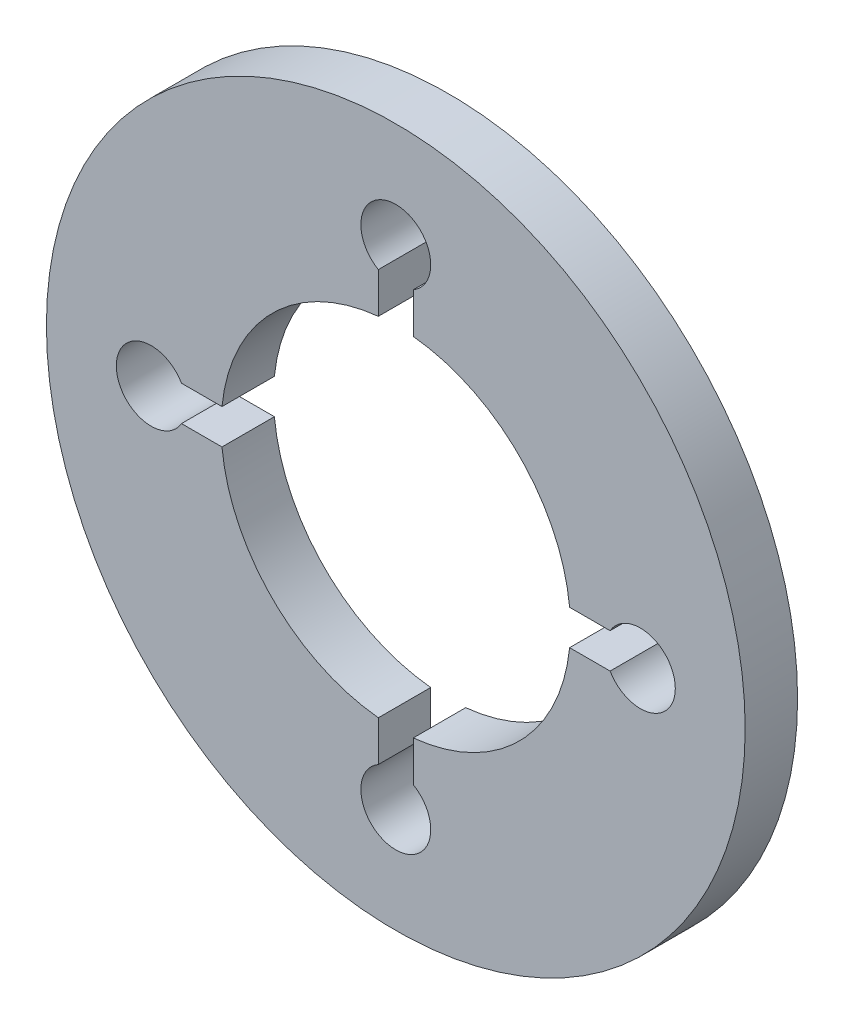
ISO-10303-21;
HEADER;
FILE_DESCRIPTION(('STEP AP214'),'2;1');
FILE_NAME('part.step','',(''),(''),'','','');
FILE_SCHEMA(('AUTOMOTIVE_DESIGN { 1 0 10303 214 1 1 1 1 }'));
ENDSEC;
DATA;
#1=APPLICATION_CONTEXT('core data for automotive mechanical design processes');
#2=APPLICATION_PROTOCOL_DEFINITION('international standard','automotive_design',2000,#1);
#3=PRODUCT_CONTEXT('',#1,'mechanical');
#4=PRODUCT('Part','Part','',(#3));
#5=PRODUCT_RELATED_PRODUCT_CATEGORY('part','',(#4));
#6=PRODUCT_DEFINITION_FORMATION('','',#4);
#7=PRODUCT_DEFINITION_CONTEXT('part definition',#1,'design');
#8=PRODUCT_DEFINITION('design','',#6,#7);
#9=PRODUCT_DEFINITION_SHAPE('','',#8);
#10=(LENGTH_UNIT() NAMED_UNIT(*) SI_UNIT(.MILLI.,.METRE.));
#11=(NAMED_UNIT(*) PLANE_ANGLE_UNIT() SI_UNIT($,.RADIAN.));
#12=(NAMED_UNIT(*) SI_UNIT($,.STERADIAN.) SOLID_ANGLE_UNIT());
#13=UNCERTAINTY_MEASURE_WITH_UNIT(LENGTH_MEASURE(1.E-05),#10,'distance_accuracy_value','');
#14=(GEOMETRIC_REPRESENTATION_CONTEXT(3) GLOBAL_UNCERTAINTY_ASSIGNED_CONTEXT((#13)) GLOBAL_UNIT_ASSIGNED_CONTEXT((#10,
#11,#12)) REPRESENTATION_CONTEXT('',''));
#15=CARTESIAN_POINT('',(0.,0.,0.));
#16=DIRECTION('',(0.,0.,1.));
#17=DIRECTION('',(1.,0.,0.));
#18=AXIS2_PLACEMENT_3D('',#15,#16,#17);
#19=CARTESIAN_POINT('',(0.,0.,0.75));
#20=DIRECTION('',(0.,0.,1.));
#21=DIRECTION('',(1.,0.,0.));
#22=AXIS2_PLACEMENT_3D('',#19,#20,#21);
#23=PLANE('',#22);
#24=CARTESIAN_POINT('',(0.,0.,0.75));
#25=DIRECTION('',(0.,0.,1.));
#26=DIRECTION('',(1.,0.,0.));
#27=AXIS2_PLACEMENT_3D('',#24,#25,#26);
#28=CIRCLE('',#27,5.);
#29=CARTESIAN_POINT('',(5.,0.,0.75));
#30=VERTEX_POINT('',#29);
#31=EDGE_CURVE('E11',#30,#30,#28,.T.);
#32=ORIENTED_EDGE('',*,*,#31,.T.);
#33=EDGE_LOOP('',(#32));
#34=FACE_BOUND('',#33,.T.);
#35=DIRECTION('',(1.,0.,0.));
#36=VECTOR('',#35,1.);
#37=CARTESIAN_POINT('',(3.06698729810778,-0.25,0.75));
#38=LINE('',#37,#36);
#39=CARTESIAN_POINT('',(2.48746859276655,-0.250000000000009,0.75));
#40=VERTEX_POINT('',#39);
#41=CARTESIAN_POINT('',(3.06698729810778,-0.25,0.75));
#42=VERTEX_POINT('',#41);
#43=EDGE_CURVE('E153',#40,#42,#38,.T.);
#44=ORIENTED_EDGE('',*,*,#43,.F.);
#45=CARTESIAN_POINT('',(0.,0.,0.75));
#46=DIRECTION('',(0.,0.,1.));
#47=DIRECTION('',(1.,0.,0.));
#48=AXIS2_PLACEMENT_3D('',#45,#46,#47);
#49=CIRCLE('',#48,2.5);
#50=CARTESIAN_POINT('',(0.249999999999983,-2.48746859276655,0.75));
#51=VERTEX_POINT('',#50);
#52=EDGE_CURVE('E145',#51,#40,#49,.T.);
#53=ORIENTED_EDGE('',*,*,#52,.F.);
#54=DIRECTION('',(0.,1.,0.));
#55=VECTOR('',#54,1.);
#56=CARTESIAN_POINT('',(0.25,-3.06698729810778,0.75));
#57=LINE('',#56,#55);
#58=CARTESIAN_POINT('',(0.25,-3.06698729810778,0.75));
#59=VERTEX_POINT('',#58);
#60=EDGE_CURVE('E193',#59,#51,#57,.T.);
#61=ORIENTED_EDGE('',*,*,#60,.F.);
#62=CARTESIAN_POINT('',(0.,-3.5,0.75));
#63=DIRECTION('',(0.,0.,1.));
#64=DIRECTION('',(1.,0.,0.));
#65=AXIS2_PLACEMENT_3D('',#62,#63,#64);
#66=CIRCLE('',#65,0.5);
#67=CARTESIAN_POINT('',(-0.25,-3.06698729810778,0.75));
#68=VERTEX_POINT('',#67);
#69=EDGE_CURVE('E191',#68,#59,#66,.T.);
#70=ORIENTED_EDGE('',*,*,#69,.F.);
#71=DIRECTION('',(0.,-1.,0.));
#72=VECTOR('',#71,1.);
#73=CARTESIAN_POINT('',(-0.25,-3.06698729810778,0.75));
#74=LINE('',#73,#72);
#75=CARTESIAN_POINT('',(-0.250000000000018,-2.48746859276655,0.75));
#76=VERTEX_POINT('',#75);
#77=EDGE_CURVE('E189',#76,#68,#74,.T.);
#78=ORIENTED_EDGE('',*,*,#77,.F.);
#79=CARTESIAN_POINT('',(0.,0.,0.75));
#80=DIRECTION('',(0.,0.,1.));
#81=DIRECTION('',(1.,0.,0.));
#82=AXIS2_PLACEMENT_3D('',#79,#80,#81);
#83=CIRCLE('',#82,2.5);
#84=CARTESIAN_POINT('',(-2.48746859276655,-0.249999999999973,0.75));
#85=VERTEX_POINT('',#84);
#86=EDGE_CURVE('E187',#85,#76,#83,.T.);
#87=ORIENTED_EDGE('',*,*,#86,.F.);
#88=DIRECTION('',(1.,0.,0.));
#89=VECTOR('',#88,1.);
#90=CARTESIAN_POINT('',(-3.06698729810778,-0.249999999999999,0.75));
#91=LINE('',#90,#89);
#92=CARTESIAN_POINT('',(-3.06698729810778,-0.249999999999999,0.75));
#93=VERTEX_POINT('',#92);
#94=EDGE_CURVE('E185',#93,#85,#91,.T.);
#95=ORIENTED_EDGE('',*,*,#94,.F.);
#96=CARTESIAN_POINT('',(-3.5,0.,0.75));
#97=DIRECTION('',(0.,0.,1.));
#98=DIRECTION('',(1.,0.,0.));
#99=AXIS2_PLACEMENT_3D('',#96,#97,#98);
#100=CIRCLE('',#99,0.5);
#101=CARTESIAN_POINT('',(-3.06698729810778,0.250000000000001,0.75));
#102=VERTEX_POINT('',#101);
#103=EDGE_CURVE('E183',#102,#93,#100,.T.);
#104=ORIENTED_EDGE('',*,*,#103,.F.);
#105=DIRECTION('',(-1.,0.,0.));
#106=VECTOR('',#105,1.);
#107=CARTESIAN_POINT('',(-3.06698729810778,0.250000000000001,0.75));
#108=LINE('',#107,#106);
#109=CARTESIAN_POINT('',(-2.48746859276655,0.250000000000027,0.75));
#110=VERTEX_POINT('',#109);
#111=EDGE_CURVE('E181',#110,#102,#108,.T.);
#112=ORIENTED_EDGE('',*,*,#111,.F.);
#113=CARTESIAN_POINT('',(0.,0.,0.75));
#114=DIRECTION('',(0.,0.,1.));
#115=DIRECTION('',(1.,0.,0.));
#116=AXIS2_PLACEMENT_3D('',#113,#114,#115);
#117=CIRCLE('',#116,2.5);
#118=CARTESIAN_POINT('',(-0.25,2.48746859276655,0.75));
#119=VERTEX_POINT('',#118);
#120=EDGE_CURVE('E179',#119,#110,#117,.T.);
#121=ORIENTED_EDGE('',*,*,#120,.F.);
#122=DIRECTION('',(0.,-1.,0.));
#123=VECTOR('',#122,1.);
#124=CARTESIAN_POINT('',(-0.25,3.06698729810778,0.75));
#125=LINE('',#124,#123);
#126=CARTESIAN_POINT('',(-0.25,3.06698729810778,0.75));
#127=VERTEX_POINT('',#126);
#128=EDGE_CURVE('E177',#127,#119,#125,.T.);
#129=ORIENTED_EDGE('',*,*,#128,.F.);
#130=CARTESIAN_POINT('',(0.,3.5,0.75));
#131=DIRECTION('',(0.,0.,1.));
#132=DIRECTION('',(1.,0.,0.));
#133=AXIS2_PLACEMENT_3D('',#130,#131,#132);
#134=CIRCLE('',#133,0.5);
#135=CARTESIAN_POINT('',(0.25,3.06698729810778,0.75));
#136=VERTEX_POINT('',#135);
#137=EDGE_CURVE('E175',#136,#127,#134,.T.);
#138=ORIENTED_EDGE('',*,*,#137,.F.);
#139=DIRECTION('',(0.,1.,0.));
#140=VECTOR('',#139,1.);
#141=CARTESIAN_POINT('',(0.25,3.06698729810778,0.75));
#142=LINE('',#141,#140);
#143=CARTESIAN_POINT('',(0.25,2.48746859276655,0.75));
#144=VERTEX_POINT('',#143);
#145=EDGE_CURVE('E173',#144,#136,#142,.T.);
#146=ORIENTED_EDGE('',*,*,#145,.F.);
#147=CARTESIAN_POINT('',(0.,0.,0.75));
#148=DIRECTION('',(0.,0.,1.));
#149=DIRECTION('',(1.,0.,0.));
#150=AXIS2_PLACEMENT_3D('',#147,#148,#149);
#151=CIRCLE('',#150,2.5);
#152=CARTESIAN_POINT('',(2.48746859276655,0.249999999999991,0.75));
#153=VERTEX_POINT('',#152);
#154=EDGE_CURVE('E171',#153,#144,#151,.T.);
#155=ORIENTED_EDGE('',*,*,#154,.F.);
#156=DIRECTION('',(-1.,0.,0.));
#157=VECTOR('',#156,1.);
#158=CARTESIAN_POINT('',(3.06698729810778,0.25,0.75));
#159=LINE('',#158,#157);
#160=CARTESIAN_POINT('',(3.06698729810778,0.25,0.75));
#161=VERTEX_POINT('',#160);
#162=EDGE_CURVE('E167',#161,#153,#159,.T.);
#163=ORIENTED_EDGE('',*,*,#162,.F.);
#164=CARTESIAN_POINT('',(3.5,0.,0.75));
#165=DIRECTION('',(0.,0.,1.));
#166=DIRECTION('',(1.,0.,0.));
#167=AXIS2_PLACEMENT_3D('',#164,#165,#166);
#168=CIRCLE('',#167,0.5);
#169=EDGE_CURVE('E165',#42,#161,#168,.T.);
#170=ORIENTED_EDGE('',*,*,#169,.F.);
#171=EDGE_LOOP('',(#44,#53,#61,#70,#78,#87,#95,#104,#112,#121,#129,#138,#146,#155,#163,#170));
#172=FACE_BOUND('',#171,.T.);
#173=ADVANCED_FACE('F32',(#34,#172),#23,.T.);
#174=CARTESIAN_POINT('',(0.,0.,0.));
#175=DIRECTION('',(0.,0.,1.));
#176=DIRECTION('',(1.,0.,0.));
#177=AXIS2_PLACEMENT_3D('',#174,#175,#176);
#178=PLANE('',#177);
#179=CARTESIAN_POINT('',(0.,0.,0.));
#180=DIRECTION('',(0.,0.,1.));
#181=DIRECTION('',(1.,0.,0.));
#182=AXIS2_PLACEMENT_3D('',#179,#180,#181);
#183=CIRCLE('',#182,5.);
#184=CARTESIAN_POINT('',(5.,0.,0.));
#185=VERTEX_POINT('',#184);
#186=EDGE_CURVE('E36',#185,#185,#183,.T.);
#187=ORIENTED_EDGE('',*,*,#186,.F.);
#188=EDGE_LOOP('',(#187));
#189=FACE_BOUND('',#188,.T.);
#190=CARTESIAN_POINT('',(0.,0.,0.));
#191=DIRECTION('',(0.,0.,1.));
#192=DIRECTION('',(1.,0.,0.));
#193=AXIS2_PLACEMENT_3D('',#190,#191,#192);
#194=CIRCLE('',#193,2.5);
#195=CARTESIAN_POINT('',(0.249999999999983,-2.48746859276655,0.));
#196=VERTEX_POINT('',#195);
#197=CARTESIAN_POINT('',(2.48746859276655,-0.250000000000009,0.));
#198=VERTEX_POINT('',#197);
#199=EDGE_CURVE('E55',#196,#198,#194,.T.);
#200=ORIENTED_EDGE('',*,*,#199,.T.);
#201=DIRECTION('',(1.,0.,0.));
#202=VECTOR('',#201,1.);
#203=CARTESIAN_POINT('',(3.06698729810778,-0.25,0.));
#204=LINE('',#203,#202);
#205=CARTESIAN_POINT('',(3.06698729810778,-0.25,0.));
#206=VERTEX_POINT('',#205);
#207=EDGE_CURVE('E160',#198,#206,#204,.T.);
#208=ORIENTED_EDGE('',*,*,#207,.T.);
#209=CARTESIAN_POINT('',(3.5,0.,0.));
#210=DIRECTION('',(0.,0.,1.));
#211=DIRECTION('',(1.,0.,0.));
#212=AXIS2_PLACEMENT_3D('',#209,#210,#211);
#213=CIRCLE('',#212,0.5);
#214=CARTESIAN_POINT('',(3.06698729810778,0.25,0.));
#215=VERTEX_POINT('',#214);
#216=EDGE_CURVE('E197',#206,#215,#213,.T.);
#217=ORIENTED_EDGE('',*,*,#216,.T.);
#218=DIRECTION('',(-1.,0.,0.));
#219=VECTOR('',#218,1.);
#220=CARTESIAN_POINT('',(3.06698729810778,0.25,0.));
#221=LINE('',#220,#219);
#222=CARTESIAN_POINT('',(2.48746859276655,0.249999999999991,0.));
#223=VERTEX_POINT('',#222);
#224=EDGE_CURVE('E200',#215,#223,#221,.T.);
#225=ORIENTED_EDGE('',*,*,#224,.T.);
#226=CARTESIAN_POINT('',(0.,0.,0.));
#227=DIRECTION('',(0.,0.,1.));
#228=DIRECTION('',(1.,0.,0.));
#229=AXIS2_PLACEMENT_3D('',#226,#227,#228);
#230=CIRCLE('',#229,2.5);
#231=CARTESIAN_POINT('',(0.25,2.48746859276655,0.));
#232=VERTEX_POINT('',#231);
#233=EDGE_CURVE('E203',#223,#232,#230,.T.);
#234=ORIENTED_EDGE('',*,*,#233,.T.);
#235=DIRECTION('',(0.,1.,0.));
#236=VECTOR('',#235,1.);
#237=CARTESIAN_POINT('',(0.25,3.06698729810778,0.));
#238=LINE('',#237,#236);
#239=CARTESIAN_POINT('',(0.25,3.06698729810778,0.));
#240=VERTEX_POINT('',#239);
#241=EDGE_CURVE('E206',#232,#240,#238,.T.);
#242=ORIENTED_EDGE('',*,*,#241,.T.);
#243=CARTESIAN_POINT('',(0.,3.5,0.));
#244=DIRECTION('',(0.,0.,1.));
#245=DIRECTION('',(1.,0.,0.));
#246=AXIS2_PLACEMENT_3D('',#243,#244,#245);
#247=CIRCLE('',#246,0.5);
#248=CARTESIAN_POINT('',(-0.25,3.06698729810778,0.));
#249=VERTEX_POINT('',#248);
#250=EDGE_CURVE('E209',#240,#249,#247,.T.);
#251=ORIENTED_EDGE('',*,*,#250,.T.);
#252=DIRECTION('',(0.,-1.,0.));
#253=VECTOR('',#252,1.);
#254=CARTESIAN_POINT('',(-0.25,3.06698729810778,0.));
#255=LINE('',#254,#253);
#256=CARTESIAN_POINT('',(-0.25,2.48746859276655,0.));
#257=VERTEX_POINT('',#256);
#258=EDGE_CURVE('E212',#249,#257,#255,.T.);
#259=ORIENTED_EDGE('',*,*,#258,.T.);
#260=CARTESIAN_POINT('',(0.,0.,0.));
#261=DIRECTION('',(0.,0.,1.));
#262=DIRECTION('',(1.,0.,0.));
#263=AXIS2_PLACEMENT_3D('',#260,#261,#262);
#264=CIRCLE('',#263,2.5);
#265=CARTESIAN_POINT('',(-2.48746859276655,0.250000000000027,0.));
#266=VERTEX_POINT('',#265);
#267=EDGE_CURVE('E215',#257,#266,#264,.T.);
#268=ORIENTED_EDGE('',*,*,#267,.T.);
#269=DIRECTION('',(-1.,0.,0.));
#270=VECTOR('',#269,1.);
#271=CARTESIAN_POINT('',(-3.06698729810778,0.250000000000001,0.));
#272=LINE('',#271,#270);
#273=CARTESIAN_POINT('',(-3.06698729810778,0.250000000000001,0.));
#274=VERTEX_POINT('',#273);
#275=EDGE_CURVE('E218',#266,#274,#272,.T.);
#276=ORIENTED_EDGE('',*,*,#275,.T.);
#277=CARTESIAN_POINT('',(-3.5,0.,0.));
#278=DIRECTION('',(0.,0.,1.));
#279=DIRECTION('',(1.,0.,0.));
#280=AXIS2_PLACEMENT_3D('',#277,#278,#279);
#281=CIRCLE('',#280,0.5);
#282=CARTESIAN_POINT('',(-3.06698729810778,-0.249999999999999,0.));
#283=VERTEX_POINT('',#282);
#284=EDGE_CURVE('E221',#274,#283,#281,.T.);
#285=ORIENTED_EDGE('',*,*,#284,.T.);
#286=DIRECTION('',(1.,0.,0.));
#287=VECTOR('',#286,1.);
#288=CARTESIAN_POINT('',(-3.06698729810778,-0.249999999999999,0.));
#289=LINE('',#288,#287);
#290=CARTESIAN_POINT('',(-2.48746859276655,-0.249999999999973,0.));
#291=VERTEX_POINT('',#290);
#292=EDGE_CURVE('E224',#283,#291,#289,.T.);
#293=ORIENTED_EDGE('',*,*,#292,.T.);
#294=CARTESIAN_POINT('',(0.,0.,0.));
#295=DIRECTION('',(0.,0.,1.));
#296=DIRECTION('',(1.,0.,0.));
#297=AXIS2_PLACEMENT_3D('',#294,#295,#296);
#298=CIRCLE('',#297,2.5);
#299=CARTESIAN_POINT('',(-0.250000000000018,-2.48746859276655,0.));
#300=VERTEX_POINT('',#299);
#301=EDGE_CURVE('E227',#291,#300,#298,.T.);
#302=ORIENTED_EDGE('',*,*,#301,.T.);
#303=DIRECTION('',(0.,-1.,0.));
#304=VECTOR('',#303,1.);
#305=CARTESIAN_POINT('',(-0.25,-3.06698729810778,0.));
#306=LINE('',#305,#304);
#307=CARTESIAN_POINT('',(-0.25,-3.06698729810778,0.));
#308=VERTEX_POINT('',#307);
#309=EDGE_CURVE('E230',#300,#308,#306,.T.);
#310=ORIENTED_EDGE('',*,*,#309,.T.);
#311=CARTESIAN_POINT('',(0.,-3.5,0.));
#312=DIRECTION('',(0.,0.,1.));
#313=DIRECTION('',(1.,0.,0.));
#314=AXIS2_PLACEMENT_3D('',#311,#312,#313);
#315=CIRCLE('',#314,0.5);
#316=CARTESIAN_POINT('',(0.25,-3.06698729810778,0.));
#317=VERTEX_POINT('',#316);
#318=EDGE_CURVE('E233',#308,#317,#315,.T.);
#319=ORIENTED_EDGE('',*,*,#318,.T.);
#320=DIRECTION('',(0.,1.,0.));
#321=VECTOR('',#320,1.);
#322=CARTESIAN_POINT('',(0.25,-3.06698729810778,0.));
#323=LINE('',#322,#321);
#324=EDGE_CURVE('E154',#317,#196,#323,.T.);
#325=ORIENTED_EDGE('',*,*,#324,.T.);
#326=EDGE_LOOP('',(#200,#208,#217,#225,#234,#242,#251,#259,#268,#276,#285,#293,#302,#310,#319,#325));
#327=FACE_BOUND('',#326,.T.);
#328=ADVANCED_FACE('F270',(#189,#327),#178,.F.);
#329=CARTESIAN_POINT('',(0.,0.,0.75));
#330=DIRECTION('',(0.,0.,-1.));
#331=DIRECTION('',(-1.,0.,0.));
#332=AXIS2_PLACEMENT_3D('',#329,#330,#331);
#333=CYLINDRICAL_SURFACE('',#332,5.);
#334=ORIENTED_EDGE('',*,*,#31,.F.);
#335=EDGE_LOOP('',(#334));
#336=FACE_BOUND('',#335,.T.);
#337=ORIENTED_EDGE('',*,*,#186,.T.);
#338=EDGE_LOOP('',(#337));
#339=FACE_BOUND('',#338,.T.);
#340=ADVANCED_FACE('F34',(#336,#339),#333,.T.);
#341=CARTESIAN_POINT('',(0.,0.,0.75));
#342=DIRECTION('',(0.,0.,-1.));
#343=DIRECTION('',(-1.,0.,0.));
#344=AXIS2_PLACEMENT_3D('',#341,#342,#343);
#345=CYLINDRICAL_SURFACE('',#344,2.5);
#346=ORIENTED_EDGE('',*,*,#199,.F.);
#347=DIRECTION('',(0.,0.,-1.));
#348=VECTOR('',#347,1.);
#349=CARTESIAN_POINT('',(0.249999999999983,-2.48746859276655,0.75));
#350=LINE('',#349,#348);
#351=EDGE_CURVE('E149',#51,#196,#350,.T.);
#352=ORIENTED_EDGE('',*,*,#351,.F.);
#353=ORIENTED_EDGE('',*,*,#52,.T.);
#354=DIRECTION('',(0.,0.,-1.));
#355=VECTOR('',#354,1.);
#356=CARTESIAN_POINT('',(2.48746859276655,-0.250000000000009,0.75));
#357=LINE('',#356,#355);
#358=EDGE_CURVE('E148',#40,#198,#357,.T.);
#359=ORIENTED_EDGE('',*,*,#358,.T.);
#360=EDGE_LOOP('',(#346,#352,#353,#359));
#361=FACE_BOUND('',#360,.T.);
#362=ADVANCED_FACE('F147',(#361),#345,.F.);
#363=CARTESIAN_POINT('',(3.06698729810778,-0.25,0.75));
#364=DIRECTION('',(0.,1.,0.));
#365=DIRECTION('',(-1.,0.,0.));
#366=AXIS2_PLACEMENT_3D('',#363,#364,#365);
#367=PLANE('',#366);
#368=ORIENTED_EDGE('',*,*,#207,.F.);
#369=ORIENTED_EDGE('',*,*,#358,.F.);
#370=ORIENTED_EDGE('',*,*,#43,.T.);
#371=DIRECTION('',(0.,0.,-1.));
#372=VECTOR('',#371,1.);
#373=CARTESIAN_POINT('',(3.06698729810778,-0.25,0.75));
#374=LINE('',#373,#372);
#375=EDGE_CURVE('E161',#42,#206,#374,.T.);
#376=ORIENTED_EDGE('',*,*,#375,.T.);
#377=EDGE_LOOP('',(#368,#369,#370,#376));
#378=FACE_BOUND('',#377,.T.);
#379=ADVANCED_FACE('F157',(#378),#367,.T.);
#380=CARTESIAN_POINT('',(3.5,0.,0.75));
#381=DIRECTION('',(0.,0.,-1.));
#382=DIRECTION('',(-1.,0.,0.));
#383=AXIS2_PLACEMENT_3D('',#380,#381,#382);
#384=CYLINDRICAL_SURFACE('',#383,0.5);
#385=ORIENTED_EDGE('',*,*,#216,.F.);
#386=ORIENTED_EDGE('',*,*,#375,.F.);
#387=ORIENTED_EDGE('',*,*,#169,.T.);
#388=DIRECTION('',(0.,0.,-1.));
#389=VECTOR('',#388,1.);
#390=CARTESIAN_POINT('',(3.06698729810778,0.25,0.75));
#391=LINE('',#390,#389);
#392=EDGE_CURVE('E262',#161,#215,#391,.T.);
#393=ORIENTED_EDGE('',*,*,#392,.T.);
#394=EDGE_LOOP('',(#385,#386,#387,#393));
#395=FACE_BOUND('',#394,.T.);
#396=ADVANCED_FACE('F266',(#395),#384,.F.);
#397=CARTESIAN_POINT('',(3.06698729810778,0.25,0.75));
#398=DIRECTION('',(0.,-1.,0.));
#399=DIRECTION('',(1.,0.,0.));
#400=AXIS2_PLACEMENT_3D('',#397,#398,#399);
#401=PLANE('',#400);
#402=ORIENTED_EDGE('',*,*,#224,.F.);
#403=ORIENTED_EDGE('',*,*,#392,.F.);
#404=ORIENTED_EDGE('',*,*,#162,.T.);
#405=DIRECTION('',(0.,0.,-1.));
#406=VECTOR('',#405,1.);
#407=CARTESIAN_POINT('',(2.48746859276655,0.249999999999991,0.75));
#408=LINE('',#407,#406);
#409=EDGE_CURVE('E260',#153,#223,#408,.T.);
#410=ORIENTED_EDGE('',*,*,#409,.T.);
#411=EDGE_LOOP('',(#402,#403,#404,#410));
#412=FACE_BOUND('',#411,.T.);
#413=ADVANCED_FACE('F328',(#412),#401,.T.);
#414=CARTESIAN_POINT('',(0.,0.,0.75));
#415=DIRECTION('',(0.,0.,-1.));
#416=DIRECTION('',(-1.,0.,0.));
#417=AXIS2_PLACEMENT_3D('',#414,#415,#416);
#418=CYLINDRICAL_SURFACE('',#417,2.5);
#419=ORIENTED_EDGE('',*,*,#233,.F.);
#420=ORIENTED_EDGE('',*,*,#409,.F.);
#421=ORIENTED_EDGE('',*,*,#154,.T.);
#422=DIRECTION('',(0.,0.,-1.));
#423=VECTOR('',#422,1.);
#424=CARTESIAN_POINT('',(0.25,2.48746859276655,0.75));
#425=LINE('',#424,#423);
#426=EDGE_CURVE('E258',#144,#232,#425,.T.);
#427=ORIENTED_EDGE('',*,*,#426,.T.);
#428=EDGE_LOOP('',(#419,#420,#421,#427));
#429=FACE_BOUND('',#428,.T.);
#430=ADVANCED_FACE('F325',(#429),#418,.F.);
#431=CARTESIAN_POINT('',(0.25,3.06698729810778,0.75));
#432=DIRECTION('',(-1.,0.,0.));
#433=DIRECTION('',(0.,-1.,0.));
#434=AXIS2_PLACEMENT_3D('',#431,#432,#433);
#435=PLANE('',#434);
#436=ORIENTED_EDGE('',*,*,#241,.F.);
#437=ORIENTED_EDGE('',*,*,#426,.F.);
#438=ORIENTED_EDGE('',*,*,#145,.T.);
#439=DIRECTION('',(0.,0.,-1.));
#440=VECTOR('',#439,1.);
#441=CARTESIAN_POINT('',(0.25,3.06698729810778,0.75));
#442=LINE('',#441,#440);
#443=EDGE_CURVE('E256',#136,#240,#442,.T.);
#444=ORIENTED_EDGE('',*,*,#443,.T.);
#445=EDGE_LOOP('',(#436,#437,#438,#444));
#446=FACE_BOUND('',#445,.T.);
#447=ADVANCED_FACE('F322',(#446),#435,.T.);
#448=CARTESIAN_POINT('',(0.,3.5,0.75));
#449=DIRECTION('',(0.,0.,-1.));
#450=DIRECTION('',(-1.,0.,0.));
#451=AXIS2_PLACEMENT_3D('',#448,#449,#450);
#452=CYLINDRICAL_SURFACE('',#451,0.5);
#453=ORIENTED_EDGE('',*,*,#250,.F.);
#454=ORIENTED_EDGE('',*,*,#443,.F.);
#455=ORIENTED_EDGE('',*,*,#137,.T.);
#456=DIRECTION('',(0.,0.,-1.));
#457=VECTOR('',#456,1.);
#458=CARTESIAN_POINT('',(-0.25,3.06698729810778,0.75));
#459=LINE('',#458,#457);
#460=EDGE_CURVE('E254',#127,#249,#459,.T.);
#461=ORIENTED_EDGE('',*,*,#460,.T.);
#462=EDGE_LOOP('',(#453,#454,#455,#461));
#463=FACE_BOUND('',#462,.T.);
#464=ADVANCED_FACE('F315',(#463),#452,.F.);
#465=CARTESIAN_POINT('',(-0.25,3.06698729810778,0.75));
#466=DIRECTION('',(1.,0.,0.));
#467=DIRECTION('',(0.,1.,0.));
#468=AXIS2_PLACEMENT_3D('',#465,#466,#467);
#469=PLANE('',#468);
#470=ORIENTED_EDGE('',*,*,#258,.F.);
#471=ORIENTED_EDGE('',*,*,#460,.F.);
#472=ORIENTED_EDGE('',*,*,#128,.T.);
#473=DIRECTION('',(0.,0.,-1.));
#474=VECTOR('',#473,1.);
#475=CARTESIAN_POINT('',(-0.25,2.48746859276655,0.75));
#476=LINE('',#475,#474);
#477=EDGE_CURVE('E252',#119,#257,#476,.T.);
#478=ORIENTED_EDGE('',*,*,#477,.T.);
#479=EDGE_LOOP('',(#470,#471,#472,#478));
#480=FACE_BOUND('',#479,.T.);
#481=ADVANCED_FACE('F311',(#480),#469,.T.);
#482=CARTESIAN_POINT('',(0.,0.,0.75));
#483=DIRECTION('',(0.,0.,-1.));
#484=DIRECTION('',(-1.,0.,0.));
#485=AXIS2_PLACEMENT_3D('',#482,#483,#484);
#486=CYLINDRICAL_SURFACE('',#485,2.5);
#487=ORIENTED_EDGE('',*,*,#267,.F.);
#488=ORIENTED_EDGE('',*,*,#477,.F.);
#489=ORIENTED_EDGE('',*,*,#120,.T.);
#490=DIRECTION('',(0.,0.,-1.));
#491=VECTOR('',#490,1.);
#492=CARTESIAN_POINT('',(-2.48746859276655,0.250000000000027,0.75));
#493=LINE('',#492,#491);
#494=EDGE_CURVE('E250',#110,#266,#493,.T.);
#495=ORIENTED_EDGE('',*,*,#494,.T.);
#496=EDGE_LOOP('',(#487,#488,#489,#495));
#497=FACE_BOUND('',#496,.T.);
#498=ADVANCED_FACE('F308',(#497),#486,.F.);
#499=CARTESIAN_POINT('',(-3.06698729810778,0.250000000000001,0.75));
#500=DIRECTION('',(0.,-1.,0.));
#501=DIRECTION('',(1.,0.,0.));
#502=AXIS2_PLACEMENT_3D('',#499,#500,#501);
#503=PLANE('',#502);
#504=ORIENTED_EDGE('',*,*,#275,.F.);
#505=ORIENTED_EDGE('',*,*,#494,.F.);
#506=ORIENTED_EDGE('',*,*,#111,.T.);
#507=DIRECTION('',(0.,0.,-1.));
#508=VECTOR('',#507,1.);
#509=CARTESIAN_POINT('',(-3.06698729810778,0.250000000000001,0.75));
#510=LINE('',#509,#508);
#511=EDGE_CURVE('E248',#102,#274,#510,.T.);
#512=ORIENTED_EDGE('',*,*,#511,.T.);
#513=EDGE_LOOP('',(#504,#505,#506,#512));
#514=FACE_BOUND('',#513,.T.);
#515=ADVANCED_FACE('F300',(#514),#503,.T.);
#516=CARTESIAN_POINT('',(-3.5,0.,0.75));
#517=DIRECTION('',(0.,0.,-1.));
#518=DIRECTION('',(-1.,0.,0.));
#519=AXIS2_PLACEMENT_3D('',#516,#517,#518);
#520=CYLINDRICAL_SURFACE('',#519,0.5);
#521=ORIENTED_EDGE('',*,*,#284,.F.);
#522=ORIENTED_EDGE('',*,*,#511,.F.);
#523=ORIENTED_EDGE('',*,*,#103,.T.);
#524=DIRECTION('',(0.,0.,-1.));
#525=VECTOR('',#524,1.);
#526=CARTESIAN_POINT('',(-3.06698729810778,-0.249999999999999,0.75));
#527=LINE('',#526,#525);
#528=EDGE_CURVE('E246',#93,#283,#527,.T.);
#529=ORIENTED_EDGE('',*,*,#528,.T.);
#530=EDGE_LOOP('',(#521,#522,#523,#529));
#531=FACE_BOUND('',#530,.T.);
#532=ADVANCED_FACE('F296',(#531),#520,.F.);
#533=CARTESIAN_POINT('',(-3.06698729810778,-0.249999999999999,0.75));
#534=DIRECTION('',(0.,1.,0.));
#535=DIRECTION('',(-1.,0.,0.));
#536=AXIS2_PLACEMENT_3D('',#533,#534,#535);
#537=PLANE('',#536);
#538=ORIENTED_EDGE('',*,*,#292,.F.);
#539=ORIENTED_EDGE('',*,*,#528,.F.);
#540=ORIENTED_EDGE('',*,*,#94,.T.);
#541=DIRECTION('',(0.,0.,-1.));
#542=VECTOR('',#541,1.);
#543=CARTESIAN_POINT('',(-2.48746859276655,-0.249999999999973,0.75));
#544=LINE('',#543,#542);
#545=EDGE_CURVE('E244',#85,#291,#544,.T.);
#546=ORIENTED_EDGE('',*,*,#545,.T.);
#547=EDGE_LOOP('',(#538,#539,#540,#546));
#548=FACE_BOUND('',#547,.T.);
#549=ADVANCED_FACE('F293',(#548),#537,.T.);
#550=CARTESIAN_POINT('',(0.,0.,0.75));
#551=DIRECTION('',(0.,0.,-1.));
#552=DIRECTION('',(-1.,0.,0.));
#553=AXIS2_PLACEMENT_3D('',#550,#551,#552);
#554=CYLINDRICAL_SURFACE('',#553,2.5);
#555=ORIENTED_EDGE('',*,*,#301,.F.);
#556=ORIENTED_EDGE('',*,*,#545,.F.);
#557=ORIENTED_EDGE('',*,*,#86,.T.);
#558=DIRECTION('',(0.,0.,-1.));
#559=VECTOR('',#558,1.);
#560=CARTESIAN_POINT('',(-0.250000000000018,-2.48746859276655,0.75));
#561=LINE('',#560,#559);
#562=EDGE_CURVE('E242',#76,#300,#561,.T.);
#563=ORIENTED_EDGE('',*,*,#562,.T.);
#564=EDGE_LOOP('',(#555,#556,#557,#563));
#565=FACE_BOUND('',#564,.T.);
#566=ADVANCED_FACE('F285',(#565),#554,.F.);
#567=CARTESIAN_POINT('',(-0.25,-3.06698729810778,0.75));
#568=DIRECTION('',(1.,0.,0.));
#569=DIRECTION('',(0.,1.,0.));
#570=AXIS2_PLACEMENT_3D('',#567,#568,#569);
#571=PLANE('',#570);
#572=ORIENTED_EDGE('',*,*,#309,.F.);
#573=ORIENTED_EDGE('',*,*,#562,.F.);
#574=ORIENTED_EDGE('',*,*,#77,.T.);
#575=DIRECTION('',(0.,0.,-1.));
#576=VECTOR('',#575,1.);
#577=CARTESIAN_POINT('',(-0.25,-3.06698729810778,0.75));
#578=LINE('',#577,#576);
#579=EDGE_CURVE('E240',#68,#308,#578,.T.);
#580=ORIENTED_EDGE('',*,*,#579,.T.);
#581=EDGE_LOOP('',(#572,#573,#574,#580));
#582=FACE_BOUND('',#581,.T.);
#583=ADVANCED_FACE('F281',(#582),#571,.T.);
#584=CARTESIAN_POINT('',(0.,-3.5,0.75));
#585=DIRECTION('',(0.,0.,-1.));
#586=DIRECTION('',(-1.,0.,0.));
#587=AXIS2_PLACEMENT_3D('',#584,#585,#586);
#588=CYLINDRICAL_SURFACE('',#587,0.5);
#589=ORIENTED_EDGE('',*,*,#318,.F.);
#590=ORIENTED_EDGE('',*,*,#579,.F.);
#591=ORIENTED_EDGE('',*,*,#69,.T.);
#592=DIRECTION('',(0.,0.,-1.));
#593=VECTOR('',#592,1.);
#594=CARTESIAN_POINT('',(0.25,-3.06698729810778,0.75));
#595=LINE('',#594,#593);
#596=EDGE_CURVE('E47',#59,#317,#595,.T.);
#597=ORIENTED_EDGE('',*,*,#596,.T.);
#598=EDGE_LOOP('',(#589,#590,#591,#597));
#599=FACE_BOUND('',#598,.T.);
#600=ADVANCED_FACE('F278',(#599),#588,.F.);
#601=CARTESIAN_POINT('',(0.25,-3.06698729810778,0.75));
#602=DIRECTION('',(-1.,0.,0.));
#603=DIRECTION('',(0.,-1.,0.));
#604=AXIS2_PLACEMENT_3D('',#601,#602,#603);
#605=PLANE('',#604);
#606=ORIENTED_EDGE('',*,*,#324,.F.);
#607=ORIENTED_EDGE('',*,*,#596,.F.);
#608=ORIENTED_EDGE('',*,*,#60,.T.);
#609=ORIENTED_EDGE('',*,*,#351,.T.);
#610=EDGE_LOOP('',(#606,#607,#608,#609));
#611=FACE_BOUND('',#610,.T.);
#612=ADVANCED_FACE('F272',(#611),#605,.T.);
#613=CLOSED_SHELL('',(#173,#328,#340,#362,#379,#396,#413,#430,#447,#464,#481,#498,#515,#532,
#549,#566,#583,#600,#612));
#614=MANIFOLD_SOLID_BREP('B2',#613);
#615=ADVANCED_BREP_SHAPE_REPRESENTATION('',(#18,#614),#14);
#616=SHAPE_DEFINITION_REPRESENTATION(#9,#615);
ENDSEC;
END-ISO-10303-21;
